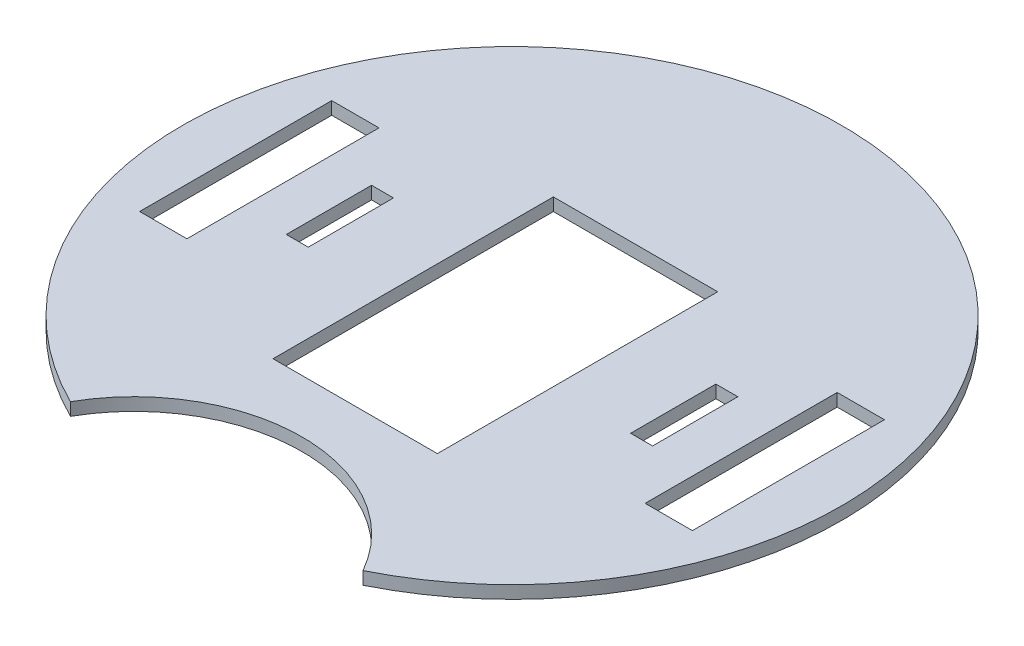
ISO-10303-21;
HEADER;
FILE_DESCRIPTION(('STEP AP214'),'2;1');
FILE_NAME('part.step','',(''),(''),'','','');
FILE_SCHEMA(('AUTOMOTIVE_DESIGN { 1 0 10303 214 1 1 1 1 }'));
ENDSEC;
DATA;
#1=APPLICATION_CONTEXT('core data for automotive mechanical design processes');
#2=APPLICATION_PROTOCOL_DEFINITION('international standard','automotive_design',2000,#1);
#3=PRODUCT_CONTEXT('',#1,'mechanical');
#4=PRODUCT('Part','Part','',(#3));
#5=PRODUCT_RELATED_PRODUCT_CATEGORY('part','',(#4));
#6=PRODUCT_DEFINITION_FORMATION('','',#4);
#7=PRODUCT_DEFINITION_CONTEXT('part definition',#1,'design');
#8=PRODUCT_DEFINITION('design','',#6,#7);
#9=PRODUCT_DEFINITION_SHAPE('','',#8);
#10=(LENGTH_UNIT() NAMED_UNIT(*) SI_UNIT(.MILLI.,.METRE.));
#11=(NAMED_UNIT(*) PLANE_ANGLE_UNIT() SI_UNIT($,.RADIAN.));
#12=(NAMED_UNIT(*) SI_UNIT($,.STERADIAN.) SOLID_ANGLE_UNIT());
#13=UNCERTAINTY_MEASURE_WITH_UNIT(LENGTH_MEASURE(1.E-05),#10,'distance_accuracy_value','');
#14=(GEOMETRIC_REPRESENTATION_CONTEXT(3) GLOBAL_UNCERTAINTY_ASSIGNED_CONTEXT((#13)) GLOBAL_UNIT_ASSIGNED_CONTEXT((#10,
#11,#12)) REPRESENTATION_CONTEXT('',''));
#15=CARTESIAN_POINT('',(0.,0.,0.));
#16=DIRECTION('',(0.,0.,1.));
#17=DIRECTION('',(1.,0.,0.));
#18=AXIS2_PLACEMENT_3D('',#15,#16,#17);
#19=CARTESIAN_POINT('',(0.,2.9,86.0416168146049));
#20=DIRECTION('',(0.,-1.,0.));
#21=DIRECTION('',(0.,0.,-1.));
#22=AXIS2_PLACEMENT_3D('',#19,#20,#21);
#23=CYLINDRICAL_SURFACE('',#22,38.25);
#24=CARTESIAN_POINT('',(0.,0.,86.0416168146049));
#25=DIRECTION('',(0.,-1.,0.));
#26=DIRECTION('',(0.,0.,1.));
#27=AXIS2_PLACEMENT_3D('',#24,#25,#26);
#28=CIRCLE('',#27,38.25);
#29=CARTESIAN_POINT('',(-33.2911053697012,0.,67.2064156406474));
#30=VERTEX_POINT('',#29);
#31=CARTESIAN_POINT('',(33.2911053697012,0.,67.2064156406474));
#32=VERTEX_POINT('',#31);
#33=EDGE_CURVE('E339',#30,#32,#28,.T.);
#34=ORIENTED_EDGE('',*,*,#33,.T.);
#35=DIRECTION('',(0.,-1.,0.));
#36=VECTOR('',#35,1.);
#37=CARTESIAN_POINT('',(33.2911053697012,2.9,67.2064156406474));
#38=LINE('',#37,#36);
#39=CARTESIAN_POINT('',(33.2911053697012,2.9,67.2064156406474));
#40=VERTEX_POINT('',#39);
#41=EDGE_CURVE('E11',#40,#32,#38,.T.);
#42=ORIENTED_EDGE('',*,*,#41,.F.);
#43=CARTESIAN_POINT('',(0.,2.9,86.0416168146049));
#44=DIRECTION('',(0.,-1.,0.));
#45=DIRECTION('',(0.,0.,1.));
#46=AXIS2_PLACEMENT_3D('',#43,#44,#45);
#47=CIRCLE('',#46,38.25);
#48=CARTESIAN_POINT('',(-33.2911053697012,2.9,67.2064156406474));
#49=VERTEX_POINT('',#48);
#50=EDGE_CURVE('E346',#49,#40,#47,.T.);
#51=ORIENTED_EDGE('',*,*,#50,.F.);
#52=DIRECTION('',(0.,-1.,0.));
#53=VECTOR('',#52,1.);
#54=CARTESIAN_POINT('',(-33.2911053697012,2.9,67.2064156406474));
#55=LINE('',#54,#53);
#56=EDGE_CURVE('E40',#49,#30,#55,.T.);
#57=ORIENTED_EDGE('',*,*,#56,.T.);
#58=EDGE_LOOP('',(#34,#42,#51,#57));
#59=FACE_BOUND('',#58,.T.);
#60=ADVANCED_FACE('F33',(#59),#23,.F.);
#61=CARTESIAN_POINT('',(0.,2.9,0.));
#62=DIRECTION('',(0.,-1.,0.));
#63=DIRECTION('',(0.,0.,-1.));
#64=AXIS2_PLACEMENT_3D('',#61,#62,#63);
#65=CYLINDRICAL_SURFACE('',#64,75.);
#66=CARTESIAN_POINT('',(0.,0.,0.));
#67=DIRECTION('',(0.,1.,0.));
#68=DIRECTION('',(0.,0.,1.));
#69=AXIS2_PLACEMENT_3D('',#66,#67,#68);
#70=CIRCLE('',#69,75.);
#71=EDGE_CURVE('E350',#32,#30,#70,.T.);
#72=ORIENTED_EDGE('',*,*,#71,.T.);
#73=ORIENTED_EDGE('',*,*,#56,.F.);
#74=CARTESIAN_POINT('',(0.,2.9,0.));
#75=DIRECTION('',(0.,1.,0.));
#76=DIRECTION('',(0.,0.,1.));
#77=AXIS2_PLACEMENT_3D('',#74,#75,#76);
#78=CIRCLE('',#77,75.);
#79=EDGE_CURVE('E349',#40,#49,#78,.T.);
#80=ORIENTED_EDGE('',*,*,#79,.F.);
#81=ORIENTED_EDGE('',*,*,#41,.T.);
#82=EDGE_LOOP('',(#72,#73,#80,#81));
#83=FACE_BOUND('',#82,.T.);
#84=ADVANCED_FACE('F362',(#83),#65,.T.);
#85=CARTESIAN_POINT('',(0.,2.9,43.0208084073025));
#86=DIRECTION('',(0.,1.,0.));
#87=DIRECTION('',(0.,0.,1.));
#88=AXIS2_PLACEMENT_3D('',#85,#86,#87);
#89=PLANE('',#88);
#90=DIRECTION('',(-1.,0.,0.));
#91=VECTOR('',#90,1.);
#92=CARTESIAN_POINT('',(41.6798528025296,2.9,-9.7));
#93=LINE('',#92,#91);
#94=CARTESIAN_POINT('',(41.6798528025296,2.9,-9.7));
#95=VERTEX_POINT('',#94);
#96=CARTESIAN_POINT('',(36.6798528025296,2.9,-9.69999999999999));
#97=VERTEX_POINT('',#96);
#98=EDGE_CURVE('E47',#95,#97,#93,.T.);
#99=ORIENTED_EDGE('',*,*,#98,.F.);
#100=DIRECTION('',(0.,0.,-1.));
#101=VECTOR('',#100,1.);
#102=CARTESIAN_POINT('',(41.6798528025296,2.9,9.7));
#103=LINE('',#102,#101);
#104=CARTESIAN_POINT('',(41.6798528025296,2.9,9.7));
#105=VERTEX_POINT('',#104);
#106=EDGE_CURVE('E199',#105,#95,#103,.T.);
#107=ORIENTED_EDGE('',*,*,#106,.F.);
#108=DIRECTION('',(1.,0.,0.));
#109=VECTOR('',#108,1.);
#110=CARTESIAN_POINT('',(41.6798528025296,2.9,9.7));
#111=LINE('',#110,#109);
#112=CARTESIAN_POINT('',(36.6798528025296,2.9,9.7));
#113=VERTEX_POINT('',#112);
#114=EDGE_CURVE('E202',#113,#105,#111,.T.);
#115=ORIENTED_EDGE('',*,*,#114,.F.);
#116=DIRECTION('',(0.,0.,1.));
#117=VECTOR('',#116,1.);
#118=CARTESIAN_POINT('',(36.6798528025296,2.9,9.7));
#119=LINE('',#118,#117);
#120=EDGE_CURVE('E208',#97,#113,#119,.T.);
#121=ORIENTED_EDGE('',*,*,#120,.F.);
#122=EDGE_LOOP('',(#99,#107,#115,#121));
#123=FACE_BOUND('',#122,.T.);
#124=DIRECTION('',(0.,0.,1.));
#125=VECTOR('',#124,1.);
#126=CARTESIAN_POINT('',(-41.6798528025296,2.9,9.7));
#127=LINE('',#126,#125);
#128=CARTESIAN_POINT('',(-41.6798528025296,2.9,-9.7));
#129=VERTEX_POINT('',#128);
#130=CARTESIAN_POINT('',(-41.6798528025296,2.9,9.7));
#131=VERTEX_POINT('',#130);
#132=EDGE_CURVE('E214',#129,#131,#127,.T.);
#133=ORIENTED_EDGE('',*,*,#132,.F.);
#134=DIRECTION('',(-1.,0.,0.));
#135=VECTOR('',#134,1.);
#136=CARTESIAN_POINT('',(-41.6798528025296,2.9,-9.7));
#137=LINE('',#136,#135);
#138=CARTESIAN_POINT('',(-36.6798528025296,2.9,-9.7));
#139=VERTEX_POINT('',#138);
#140=EDGE_CURVE('E222',#139,#129,#137,.T.);
#141=ORIENTED_EDGE('',*,*,#140,.F.);
#142=DIRECTION('',(0.,0.,-1.));
#143=VECTOR('',#142,1.);
#144=CARTESIAN_POINT('',(-36.6798528025296,2.9,9.7));
#145=LINE('',#144,#143);
#146=CARTESIAN_POINT('',(-36.6798528025296,2.9,9.7));
#147=VERTEX_POINT('',#146);
#148=EDGE_CURVE('E236',#147,#139,#145,.T.);
#149=ORIENTED_EDGE('',*,*,#148,.F.);
#150=DIRECTION('',(1.,0.,0.));
#151=VECTOR('',#150,1.);
#152=CARTESIAN_POINT('',(-41.6798528025296,2.9,9.7));
#153=LINE('',#152,#151);
#154=EDGE_CURVE('E233',#131,#147,#153,.T.);
#155=ORIENTED_EDGE('',*,*,#154,.F.);
#156=EDGE_LOOP('',(#133,#141,#149,#155));
#157=FACE_BOUND('',#156,.T.);
#158=DIRECTION('',(0.,0.,1.));
#159=VECTOR('',#158,1.);
#160=CARTESIAN_POINT('',(52.1374919880577,2.9,21.8538025937416));
#161=LINE('',#160,#159);
#162=CARTESIAN_POINT('',(52.1374919880577,2.9,-21.8538025937417));
#163=VERTEX_POINT('',#162);
#164=CARTESIAN_POINT('',(52.1374919880577,2.9,21.8538025937416));
#165=VERTEX_POINT('',#164);
#166=EDGE_CURVE('E243',#163,#165,#161,.T.);
#167=ORIENTED_EDGE('',*,*,#166,.F.);
#168=DIRECTION('',(-1.,0.,0.));
#169=VECTOR('',#168,1.);
#170=CARTESIAN_POINT('',(62.8974919880577,2.9,-21.8538025937417));
#171=LINE('',#170,#169);
#172=CARTESIAN_POINT('',(62.8974919880577,2.9,-21.8538025937417));
#173=VERTEX_POINT('',#172);
#174=EDGE_CURVE('E254',#173,#163,#171,.T.);
#175=ORIENTED_EDGE('',*,*,#174,.F.);
#176=DIRECTION('',(0.,0.,-1.));
#177=VECTOR('',#176,1.);
#178=CARTESIAN_POINT('',(62.8974919880577,2.9,21.8538025937416));
#179=LINE('',#178,#177);
#180=CARTESIAN_POINT('',(62.8974919880577,2.9,21.8538025937416));
#181=VERTEX_POINT('',#180);
#182=EDGE_CURVE('E268',#181,#173,#179,.T.);
#183=ORIENTED_EDGE('',*,*,#182,.F.);
#184=DIRECTION('',(1.,0.,0.));
#185=VECTOR('',#184,1.);
#186=CARTESIAN_POINT('',(62.8974919880577,2.9,21.8538025937416));
#187=LINE('',#186,#185);
#188=EDGE_CURVE('E265',#165,#181,#187,.T.);
#189=ORIENTED_EDGE('',*,*,#188,.F.);
#190=EDGE_LOOP('',(#167,#175,#183,#189));
#191=FACE_BOUND('',#190,.T.);
#192=DIRECTION('',(0.,0.,1.));
#193=VECTOR('',#192,1.);
#194=CARTESIAN_POINT('',(-62.8974919880577,2.9,21.8538025937416));
#195=LINE('',#194,#193);
#196=CARTESIAN_POINT('',(-62.8974919880577,2.9,-21.8538025937417));
#197=VERTEX_POINT('',#196);
#198=CARTESIAN_POINT('',(-62.8974919880577,2.9,21.8538025937416));
#199=VERTEX_POINT('',#198);
#200=EDGE_CURVE('E275',#197,#199,#195,.T.);
#201=ORIENTED_EDGE('',*,*,#200,.F.);
#202=DIRECTION('',(-1.,0.,0.));
#203=VECTOR('',#202,1.);
#204=CARTESIAN_POINT('',(-62.8974919880577,2.9,-21.8538025937417));
#205=LINE('',#204,#203);
#206=CARTESIAN_POINT('',(-52.1374919880577,2.9,-21.8538025937417));
#207=VERTEX_POINT('',#206);
#208=EDGE_CURVE('E286',#207,#197,#205,.T.);
#209=ORIENTED_EDGE('',*,*,#208,.F.);
#210=DIRECTION('',(0.,0.,-1.));
#211=VECTOR('',#210,1.);
#212=CARTESIAN_POINT('',(-52.1374919880577,2.9,21.8538025937416));
#213=LINE('',#212,#211);
#214=CARTESIAN_POINT('',(-52.1374919880577,2.9,21.8538025937416));
#215=VERTEX_POINT('',#214);
#216=EDGE_CURVE('E300',#215,#207,#213,.T.);
#217=ORIENTED_EDGE('',*,*,#216,.F.);
#218=DIRECTION('',(1.,0.,0.));
#219=VECTOR('',#218,1.);
#220=CARTESIAN_POINT('',(-62.8974919880577,2.9,21.8538025937416));
#221=LINE('',#220,#219);
#222=EDGE_CURVE('E297',#199,#215,#221,.T.);
#223=ORIENTED_EDGE('',*,*,#222,.F.);
#224=EDGE_LOOP('',(#201,#209,#217,#223));
#225=FACE_BOUND('',#224,.T.);
#226=DIRECTION('',(0.,0.,1.));
#227=VECTOR('',#226,1.);
#228=CARTESIAN_POINT('',(-18.7,2.9,35.7));
#229=LINE('',#228,#227);
#230=CARTESIAN_POINT('',(-18.7,2.9,-28.1));
#231=VERTEX_POINT('',#230);
#232=CARTESIAN_POINT('',(-18.7,2.9,35.7));
#233=VERTEX_POINT('',#232);
#234=EDGE_CURVE('E307',#231,#233,#229,.T.);
#235=ORIENTED_EDGE('',*,*,#234,.F.);
#236=DIRECTION('',(-1.,0.,0.));
#237=VECTOR('',#236,1.);
#238=CARTESIAN_POINT('',(-18.7,2.9,-28.1));
#239=LINE('',#238,#237);
#240=CARTESIAN_POINT('',(18.7,2.9,-28.1));
#241=VERTEX_POINT('',#240);
#242=EDGE_CURVE('E318',#241,#231,#239,.T.);
#243=ORIENTED_EDGE('',*,*,#242,.F.);
#244=DIRECTION('',(0.,0.,-1.));
#245=VECTOR('',#244,1.);
#246=CARTESIAN_POINT('',(18.7,2.9,35.7));
#247=LINE('',#246,#245);
#248=CARTESIAN_POINT('',(18.7,2.9,35.7));
#249=VERTEX_POINT('',#248);
#250=EDGE_CURVE('E332',#249,#241,#247,.T.);
#251=ORIENTED_EDGE('',*,*,#250,.F.);
#252=DIRECTION('',(1.,0.,0.));
#253=VECTOR('',#252,1.);
#254=CARTESIAN_POINT('',(-18.7,2.9,35.7));
#255=LINE('',#254,#253);
#256=EDGE_CURVE('E329',#233,#249,#255,.T.);
#257=ORIENTED_EDGE('',*,*,#256,.F.);
#258=EDGE_LOOP('',(#235,#243,#251,#257));
#259=FACE_BOUND('',#258,.T.);
#260=ORIENTED_EDGE('',*,*,#50,.T.);
#261=ORIENTED_EDGE('',*,*,#79,.T.);
#262=EDGE_LOOP('',(#260,#261));
#263=FACE_BOUND('',#262,.T.);
#264=ADVANCED_FACE('F364',(#123,#157,#191,#225,#259,#263),#89,.T.);
#265=CARTESIAN_POINT('',(0.,0.,43.0208084073025));
#266=DIRECTION('',(0.,1.,0.));
#267=DIRECTION('',(0.,0.,1.));
#268=AXIS2_PLACEMENT_3D('',#265,#266,#267);
#269=PLANE('',#268);
#270=DIRECTION('',(0.,0.,-1.));
#271=VECTOR('',#270,1.);
#272=CARTESIAN_POINT('',(41.6798528025296,0.,9.7));
#273=LINE('',#272,#271);
#274=CARTESIAN_POINT('',(41.6798528025296,0.,9.7));
#275=VERTEX_POINT('',#274);
#276=CARTESIAN_POINT('',(41.6798528025296,0.,-9.7));
#277=VERTEX_POINT('',#276);
#278=EDGE_CURVE('E189',#275,#277,#273,.T.);
#279=ORIENTED_EDGE('',*,*,#278,.T.);
#280=DIRECTION('',(-1.,0.,0.));
#281=VECTOR('',#280,1.);
#282=CARTESIAN_POINT('',(41.6798528025296,0.,-9.7));
#283=LINE('',#282,#281);
#284=CARTESIAN_POINT('',(36.6798528025296,0.,-9.7));
#285=VERTEX_POINT('',#284);
#286=EDGE_CURVE('E183',#277,#285,#283,.T.);
#287=ORIENTED_EDGE('',*,*,#286,.T.);
#288=DIRECTION('',(0.,0.,1.));
#289=VECTOR('',#288,1.);
#290=CARTESIAN_POINT('',(36.6798528025296,0.,9.7));
#291=LINE('',#290,#289);
#292=CARTESIAN_POINT('',(36.6798528025296,0.,9.7));
#293=VERTEX_POINT('',#292);
#294=EDGE_CURVE('E192',#285,#293,#291,.T.);
#295=ORIENTED_EDGE('',*,*,#294,.T.);
#296=DIRECTION('',(1.,0.,0.));
#297=VECTOR('',#296,1.);
#298=CARTESIAN_POINT('',(41.6798528025296,0.,9.7));
#299=LINE('',#298,#297);
#300=EDGE_CURVE('E55',#293,#275,#299,.T.);
#301=ORIENTED_EDGE('',*,*,#300,.T.);
#302=EDGE_LOOP('',(#279,#287,#295,#301));
#303=FACE_BOUND('',#302,.T.);
#304=DIRECTION('',(-1.,0.,0.));
#305=VECTOR('',#304,1.);
#306=CARTESIAN_POINT('',(-41.6798528025296,0.,-9.7));
#307=LINE('',#306,#305);
#308=CARTESIAN_POINT('',(-36.6798528025296,0.,-9.7));
#309=VERTEX_POINT('',#308);
#310=CARTESIAN_POINT('',(-41.6798528025296,0.,-9.7));
#311=VERTEX_POINT('',#310);
#312=EDGE_CURVE('E228',#309,#311,#307,.T.);
#313=ORIENTED_EDGE('',*,*,#312,.T.);
#314=DIRECTION('',(0.,0.,1.));
#315=VECTOR('',#314,1.);
#316=CARTESIAN_POINT('',(-41.6798528025296,0.,9.7));
#317=LINE('',#316,#315);
#318=CARTESIAN_POINT('',(-41.6798528025296,0.,9.7));
#319=VERTEX_POINT('',#318);
#320=EDGE_CURVE('E218',#311,#319,#317,.T.);
#321=ORIENTED_EDGE('',*,*,#320,.T.);
#322=DIRECTION('',(1.,0.,0.));
#323=VECTOR('',#322,1.);
#324=CARTESIAN_POINT('',(-41.6798528025296,0.,9.7));
#325=LINE('',#324,#323);
#326=CARTESIAN_POINT('',(-36.6798528025296,0.,9.7));
#327=VERTEX_POINT('',#326);
#328=EDGE_CURVE('E221',#319,#327,#325,.T.);
#329=ORIENTED_EDGE('',*,*,#328,.T.);
#330=DIRECTION('',(0.,0.,-1.));
#331=VECTOR('',#330,1.);
#332=CARTESIAN_POINT('',(-36.6798528025296,0.,9.7));
#333=LINE('',#332,#331);
#334=EDGE_CURVE('E225',#327,#309,#333,.T.);
#335=ORIENTED_EDGE('',*,*,#334,.T.);
#336=EDGE_LOOP('',(#313,#321,#329,#335));
#337=FACE_BOUND('',#336,.T.);
#338=DIRECTION('',(-1.,0.,0.));
#339=VECTOR('',#338,1.);
#340=CARTESIAN_POINT('',(62.8974919880577,0.,-21.8538025937417));
#341=LINE('',#340,#339);
#342=CARTESIAN_POINT('',(62.8974919880577,0.,-21.8538025937417));
#343=VERTEX_POINT('',#342);
#344=CARTESIAN_POINT('',(52.1374919880577,0.,-21.8538025937417));
#345=VERTEX_POINT('',#344);
#346=EDGE_CURVE('E260',#343,#345,#341,.T.);
#347=ORIENTED_EDGE('',*,*,#346,.T.);
#348=DIRECTION('',(0.,0.,1.));
#349=VECTOR('',#348,1.);
#350=CARTESIAN_POINT('',(52.1374919880577,0.,21.8538025937416));
#351=LINE('',#350,#349);
#352=CARTESIAN_POINT('',(52.1374919880577,0.,21.8538025937416));
#353=VERTEX_POINT('',#352);
#354=EDGE_CURVE('E250',#345,#353,#351,.T.);
#355=ORIENTED_EDGE('',*,*,#354,.T.);
#356=DIRECTION('',(1.,0.,0.));
#357=VECTOR('',#356,1.);
#358=CARTESIAN_POINT('',(62.8974919880577,0.,21.8538025937416));
#359=LINE('',#358,#357);
#360=CARTESIAN_POINT('',(62.8974919880577,0.,21.8538025937416));
#361=VERTEX_POINT('',#360);
#362=EDGE_CURVE('E253',#353,#361,#359,.T.);
#363=ORIENTED_EDGE('',*,*,#362,.T.);
#364=DIRECTION('',(0.,0.,-1.));
#365=VECTOR('',#364,1.);
#366=CARTESIAN_POINT('',(62.8974919880577,0.,21.8538025937416));
#367=LINE('',#366,#365);
#368=EDGE_CURVE('E257',#361,#343,#367,.T.);
#369=ORIENTED_EDGE('',*,*,#368,.T.);
#370=EDGE_LOOP('',(#347,#355,#363,#369));
#371=FACE_BOUND('',#370,.T.);
#372=DIRECTION('',(-1.,0.,0.));
#373=VECTOR('',#372,1.);
#374=CARTESIAN_POINT('',(-62.8974919880577,0.,-21.8538025937417));
#375=LINE('',#374,#373);
#376=CARTESIAN_POINT('',(-52.1374919880577,0.,-21.8538025937417));
#377=VERTEX_POINT('',#376);
#378=CARTESIAN_POINT('',(-62.8974919880577,0.,-21.8538025937417));
#379=VERTEX_POINT('',#378);
#380=EDGE_CURVE('E292',#377,#379,#375,.T.);
#381=ORIENTED_EDGE('',*,*,#380,.T.);
#382=DIRECTION('',(0.,0.,1.));
#383=VECTOR('',#382,1.);
#384=CARTESIAN_POINT('',(-62.8974919880577,0.,21.8538025937416));
#385=LINE('',#384,#383);
#386=CARTESIAN_POINT('',(-62.8974919880577,0.,21.8538025937416));
#387=VERTEX_POINT('',#386);
#388=EDGE_CURVE('E282',#379,#387,#385,.T.);
#389=ORIENTED_EDGE('',*,*,#388,.T.);
#390=DIRECTION('',(1.,0.,0.));
#391=VECTOR('',#390,1.);
#392=CARTESIAN_POINT('',(-62.8974919880577,0.,21.8538025937416));
#393=LINE('',#392,#391);
#394=CARTESIAN_POINT('',(-52.1374919880577,0.,21.8538025937416));
#395=VERTEX_POINT('',#394);
#396=EDGE_CURVE('E285',#387,#395,#393,.T.);
#397=ORIENTED_EDGE('',*,*,#396,.T.);
#398=DIRECTION('',(0.,0.,-1.));
#399=VECTOR('',#398,1.);
#400=CARTESIAN_POINT('',(-52.1374919880577,0.,21.8538025937416));
#401=LINE('',#400,#399);
#402=EDGE_CURVE('E289',#395,#377,#401,.T.);
#403=ORIENTED_EDGE('',*,*,#402,.T.);
#404=EDGE_LOOP('',(#381,#389,#397,#403));
#405=FACE_BOUND('',#404,.T.);
#406=DIRECTION('',(-1.,0.,0.));
#407=VECTOR('',#406,1.);
#408=CARTESIAN_POINT('',(-18.7,0.,-28.1));
#409=LINE('',#408,#407);
#410=CARTESIAN_POINT('',(18.7,0.,-28.1));
#411=VERTEX_POINT('',#410);
#412=CARTESIAN_POINT('',(-18.7,0.,-28.1));
#413=VERTEX_POINT('',#412);
#414=EDGE_CURVE('E324',#411,#413,#409,.T.);
#415=ORIENTED_EDGE('',*,*,#414,.T.);
#416=DIRECTION('',(0.,0.,1.));
#417=VECTOR('',#416,1.);
#418=CARTESIAN_POINT('',(-18.7,0.,35.7));
#419=LINE('',#418,#417);
#420=CARTESIAN_POINT('',(-18.7,0.,35.7));
#421=VERTEX_POINT('',#420);
#422=EDGE_CURVE('E314',#413,#421,#419,.T.);
#423=ORIENTED_EDGE('',*,*,#422,.T.);
#424=DIRECTION('',(1.,0.,0.));
#425=VECTOR('',#424,1.);
#426=CARTESIAN_POINT('',(-18.7,0.,35.7));
#427=LINE('',#426,#425);
#428=CARTESIAN_POINT('',(18.7,0.,35.7));
#429=VERTEX_POINT('',#428);
#430=EDGE_CURVE('E317',#421,#429,#427,.T.);
#431=ORIENTED_EDGE('',*,*,#430,.T.);
#432=DIRECTION('',(0.,0.,-1.));
#433=VECTOR('',#432,1.);
#434=CARTESIAN_POINT('',(18.7,0.,35.7));
#435=LINE('',#434,#433);
#436=EDGE_CURVE('E321',#429,#411,#435,.T.);
#437=ORIENTED_EDGE('',*,*,#436,.T.);
#438=EDGE_LOOP('',(#415,#423,#431,#437));
#439=FACE_BOUND('',#438,.T.);
#440=ORIENTED_EDGE('',*,*,#33,.F.);
#441=ORIENTED_EDGE('',*,*,#71,.F.);
#442=EDGE_LOOP('',(#440,#441));
#443=FACE_BOUND('',#442,.T.);
#444=ADVANCED_FACE('F196',(#303,#337,#371,#405,#439,#443),#269,.F.);
#445=CARTESIAN_POINT('',(-18.7,0.,35.7));
#446=DIRECTION('',(-1.,0.,0.));
#447=DIRECTION('',(0.,0.,1.));
#448=AXIS2_PLACEMENT_3D('',#445,#446,#447);
#449=PLANE('',#448);
#450=ORIENTED_EDGE('',*,*,#234,.T.);
#451=DIRECTION('',(0.,1.,0.));
#452=VECTOR('',#451,1.);
#453=CARTESIAN_POINT('',(-18.7,0.,35.7));
#454=LINE('',#453,#452);
#455=EDGE_CURVE('E327',#421,#233,#454,.T.);
#456=ORIENTED_EDGE('',*,*,#455,.F.);
#457=ORIENTED_EDGE('',*,*,#422,.F.);
#458=DIRECTION('',(0.,1.,0.));
#459=VECTOR('',#458,1.);
#460=CARTESIAN_POINT('',(-18.7,0.,-28.1));
#461=LINE('',#460,#459);
#462=EDGE_CURVE('E337',#413,#231,#461,.T.);
#463=ORIENTED_EDGE('',*,*,#462,.T.);
#464=EDGE_LOOP('',(#450,#456,#457,#463));
#465=FACE_BOUND('',#464,.T.);
#466=ADVANCED_FACE('F372',(#465),#449,.F.);
#467=CARTESIAN_POINT('',(-18.7,0.,-28.1));
#468=DIRECTION('',(0.,0.,-1.));
#469=DIRECTION('',(-1.,0.,0.));
#470=AXIS2_PLACEMENT_3D('',#467,#468,#469);
#471=PLANE('',#470);
#472=ORIENTED_EDGE('',*,*,#242,.T.);
#473=ORIENTED_EDGE('',*,*,#462,.F.);
#474=ORIENTED_EDGE('',*,*,#414,.F.);
#475=DIRECTION('',(0.,1.,0.));
#476=VECTOR('',#475,1.);
#477=CARTESIAN_POINT('',(18.7,0.,-28.1));
#478=LINE('',#477,#476);
#479=EDGE_CURVE('E340',#411,#241,#478,.T.);
#480=ORIENTED_EDGE('',*,*,#479,.T.);
#481=EDGE_LOOP('',(#472,#473,#474,#480));
#482=FACE_BOUND('',#481,.T.);
#483=ADVANCED_FACE('F393',(#482),#471,.F.);
#484=CARTESIAN_POINT('',(18.7,0.,35.7));
#485=DIRECTION('',(1.,0.,0.));
#486=DIRECTION('',(0.,0.,-1.));
#487=AXIS2_PLACEMENT_3D('',#484,#485,#486);
#488=PLANE('',#487);
#489=ORIENTED_EDGE('',*,*,#250,.T.);
#490=ORIENTED_EDGE('',*,*,#479,.F.);
#491=ORIENTED_EDGE('',*,*,#436,.F.);
#492=DIRECTION('',(0.,1.,0.));
#493=VECTOR('',#492,1.);
#494=CARTESIAN_POINT('',(18.7,0.,35.7));
#495=LINE('',#494,#493);
#496=EDGE_CURVE('E342',#429,#249,#495,.T.);
#497=ORIENTED_EDGE('',*,*,#496,.T.);
#498=EDGE_LOOP('',(#489,#490,#491,#497));
#499=FACE_BOUND('',#498,.T.);
#500=ADVANCED_FACE('F403',(#499),#488,.F.);
#501=CARTESIAN_POINT('',(-18.7,0.,35.7));
#502=DIRECTION('',(0.,0.,1.));
#503=DIRECTION('',(1.,0.,0.));
#504=AXIS2_PLACEMENT_3D('',#501,#502,#503);
#505=PLANE('',#504);
#506=ORIENTED_EDGE('',*,*,#256,.T.);
#507=ORIENTED_EDGE('',*,*,#496,.F.);
#508=ORIENTED_EDGE('',*,*,#430,.F.);
#509=ORIENTED_EDGE('',*,*,#455,.T.);
#510=EDGE_LOOP('',(#506,#507,#508,#509));
#511=FACE_BOUND('',#510,.T.);
#512=ADVANCED_FACE('F413',(#511),#505,.F.);
#513=CARTESIAN_POINT('',(-62.8974919880577,0.,21.8538025937416));
#514=DIRECTION('',(-1.,0.,0.));
#515=DIRECTION('',(0.,0.,1.));
#516=AXIS2_PLACEMENT_3D('',#513,#514,#515);
#517=PLANE('',#516);
#518=ORIENTED_EDGE('',*,*,#200,.T.);
#519=DIRECTION('',(0.,1.,0.));
#520=VECTOR('',#519,1.);
#521=CARTESIAN_POINT('',(-62.8974919880577,0.,21.8538025937416));
#522=LINE('',#521,#520);
#523=EDGE_CURVE('E295',#387,#199,#522,.T.);
#524=ORIENTED_EDGE('',*,*,#523,.F.);
#525=ORIENTED_EDGE('',*,*,#388,.F.);
#526=DIRECTION('',(0.,1.,0.));
#527=VECTOR('',#526,1.);
#528=CARTESIAN_POINT('',(-62.8974919880577,0.,-21.8538025937417));
#529=LINE('',#528,#527);
#530=EDGE_CURVE('E305',#379,#197,#529,.T.);
#531=ORIENTED_EDGE('',*,*,#530,.T.);
#532=EDGE_LOOP('',(#518,#524,#525,#531));
#533=FACE_BOUND('',#532,.T.);
#534=ADVANCED_FACE('F423',(#533),#517,.F.);
#535=CARTESIAN_POINT('',(-62.8974919880577,0.,-21.8538025937417));
#536=DIRECTION('',(0.,0.,-1.));
#537=DIRECTION('',(-1.,0.,0.));
#538=AXIS2_PLACEMENT_3D('',#535,#536,#537);
#539=PLANE('',#538);
#540=ORIENTED_EDGE('',*,*,#208,.T.);
#541=ORIENTED_EDGE('',*,*,#530,.F.);
#542=ORIENTED_EDGE('',*,*,#380,.F.);
#543=DIRECTION('',(0.,1.,0.));
#544=VECTOR('',#543,1.);
#545=CARTESIAN_POINT('',(-52.1374919880577,0.,-21.8538025937417));
#546=LINE('',#545,#544);
#547=EDGE_CURVE('E308',#377,#207,#546,.T.);
#548=ORIENTED_EDGE('',*,*,#547,.T.);
#549=EDGE_LOOP('',(#540,#541,#542,#548));
#550=FACE_BOUND('',#549,.T.);
#551=ADVANCED_FACE('F433',(#550),#539,.F.);
#552=CARTESIAN_POINT('',(-52.1374919880577,0.,21.8538025937416));
#553=DIRECTION('',(1.,0.,0.));
#554=DIRECTION('',(0.,0.,-1.));
#555=AXIS2_PLACEMENT_3D('',#552,#553,#554);
#556=PLANE('',#555);
#557=ORIENTED_EDGE('',*,*,#216,.T.);
#558=ORIENTED_EDGE('',*,*,#547,.F.);
#559=ORIENTED_EDGE('',*,*,#402,.F.);
#560=DIRECTION('',(0.,1.,0.));
#561=VECTOR('',#560,1.);
#562=CARTESIAN_POINT('',(-52.1374919880577,0.,21.8538025937416));
#563=LINE('',#562,#561);
#564=EDGE_CURVE('E310',#395,#215,#563,.T.);
#565=ORIENTED_EDGE('',*,*,#564,.T.);
#566=EDGE_LOOP('',(#557,#558,#559,#565));
#567=FACE_BOUND('',#566,.T.);
#568=ADVANCED_FACE('F443',(#567),#556,.F.);
#569=CARTESIAN_POINT('',(-62.8974919880577,0.,21.8538025937416));
#570=DIRECTION('',(0.,0.,1.));
#571=DIRECTION('',(1.,0.,0.));
#572=AXIS2_PLACEMENT_3D('',#569,#570,#571);
#573=PLANE('',#572);
#574=ORIENTED_EDGE('',*,*,#222,.T.);
#575=ORIENTED_EDGE('',*,*,#564,.F.);
#576=ORIENTED_EDGE('',*,*,#396,.F.);
#577=ORIENTED_EDGE('',*,*,#523,.T.);
#578=EDGE_LOOP('',(#574,#575,#576,#577));
#579=FACE_BOUND('',#578,.T.);
#580=ADVANCED_FACE('F453',(#579),#573,.F.);
#581=CARTESIAN_POINT('',(52.1374919880577,0.,21.8538025937416));
#582=DIRECTION('',(-1.,0.,0.));
#583=DIRECTION('',(0.,0.,1.));
#584=AXIS2_PLACEMENT_3D('',#581,#582,#583);
#585=PLANE('',#584);
#586=ORIENTED_EDGE('',*,*,#166,.T.);
#587=DIRECTION('',(0.,1.,0.));
#588=VECTOR('',#587,1.);
#589=CARTESIAN_POINT('',(52.1374919880577,0.,21.8538025937416));
#590=LINE('',#589,#588);
#591=EDGE_CURVE('E263',#353,#165,#590,.T.);
#592=ORIENTED_EDGE('',*,*,#591,.F.);
#593=ORIENTED_EDGE('',*,*,#354,.F.);
#594=DIRECTION('',(0.,1.,0.));
#595=VECTOR('',#594,1.);
#596=CARTESIAN_POINT('',(52.1374919880577,0.,-21.8538025937417));
#597=LINE('',#596,#595);
#598=EDGE_CURVE('E273',#345,#163,#597,.T.);
#599=ORIENTED_EDGE('',*,*,#598,.T.);
#600=EDGE_LOOP('',(#586,#592,#593,#599));
#601=FACE_BOUND('',#600,.T.);
#602=ADVANCED_FACE('F463',(#601),#585,.F.);
#603=CARTESIAN_POINT('',(62.8974919880577,0.,-21.8538025937417));
#604=DIRECTION('',(0.,0.,-1.));
#605=DIRECTION('',(-1.,0.,0.));
#606=AXIS2_PLACEMENT_3D('',#603,#604,#605);
#607=PLANE('',#606);
#608=ORIENTED_EDGE('',*,*,#174,.T.);
#609=ORIENTED_EDGE('',*,*,#598,.F.);
#610=ORIENTED_EDGE('',*,*,#346,.F.);
#611=DIRECTION('',(0.,1.,0.));
#612=VECTOR('',#611,1.);
#613=CARTESIAN_POINT('',(62.8974919880577,0.,-21.8538025937417));
#614=LINE('',#613,#612);
#615=EDGE_CURVE('E276',#343,#173,#614,.T.);
#616=ORIENTED_EDGE('',*,*,#615,.T.);
#617=EDGE_LOOP('',(#608,#609,#610,#616));
#618=FACE_BOUND('',#617,.T.);
#619=ADVANCED_FACE('F473',(#618),#607,.F.);
#620=CARTESIAN_POINT('',(62.8974919880577,0.,21.8538025937416));
#621=DIRECTION('',(1.,0.,0.));
#622=DIRECTION('',(0.,0.,-1.));
#623=AXIS2_PLACEMENT_3D('',#620,#621,#622);
#624=PLANE('',#623);
#625=ORIENTED_EDGE('',*,*,#182,.T.);
#626=ORIENTED_EDGE('',*,*,#615,.F.);
#627=ORIENTED_EDGE('',*,*,#368,.F.);
#628=DIRECTION('',(0.,1.,0.));
#629=VECTOR('',#628,1.);
#630=CARTESIAN_POINT('',(62.8974919880577,0.,21.8538025937416));
#631=LINE('',#630,#629);
#632=EDGE_CURVE('E278',#361,#181,#631,.T.);
#633=ORIENTED_EDGE('',*,*,#632,.T.);
#634=EDGE_LOOP('',(#625,#626,#627,#633));
#635=FACE_BOUND('',#634,.T.);
#636=ADVANCED_FACE('F483',(#635),#624,.F.);
#637=CARTESIAN_POINT('',(62.8974919880577,0.,21.8538025937416));
#638=DIRECTION('',(0.,0.,1.));
#639=DIRECTION('',(1.,0.,0.));
#640=AXIS2_PLACEMENT_3D('',#637,#638,#639);
#641=PLANE('',#640);
#642=ORIENTED_EDGE('',*,*,#188,.T.);
#643=ORIENTED_EDGE('',*,*,#632,.F.);
#644=ORIENTED_EDGE('',*,*,#362,.F.);
#645=ORIENTED_EDGE('',*,*,#591,.T.);
#646=EDGE_LOOP('',(#642,#643,#644,#645));
#647=FACE_BOUND('',#646,.T.);
#648=ADVANCED_FACE('F493',(#647),#641,.F.);
#649=CARTESIAN_POINT('',(-41.6798528025296,0.,9.7));
#650=DIRECTION('',(-1.,0.,0.));
#651=DIRECTION('',(0.,0.,1.));
#652=AXIS2_PLACEMENT_3D('',#649,#650,#651);
#653=PLANE('',#652);
#654=ORIENTED_EDGE('',*,*,#132,.T.);
#655=DIRECTION('',(0.,1.,0.));
#656=VECTOR('',#655,1.);
#657=CARTESIAN_POINT('',(-41.6798528025296,0.,9.7));
#658=LINE('',#657,#656);
#659=EDGE_CURVE('E231',#319,#131,#658,.T.);
#660=ORIENTED_EDGE('',*,*,#659,.F.);
#661=ORIENTED_EDGE('',*,*,#320,.F.);
#662=DIRECTION('',(0.,1.,0.));
#663=VECTOR('',#662,1.);
#664=CARTESIAN_POINT('',(-41.6798528025296,0.,-9.7));
#665=LINE('',#664,#663);
#666=EDGE_CURVE('E241',#311,#129,#665,.T.);
#667=ORIENTED_EDGE('',*,*,#666,.T.);
#668=EDGE_LOOP('',(#654,#660,#661,#667));
#669=FACE_BOUND('',#668,.T.);
#670=ADVANCED_FACE('F502',(#669),#653,.F.);
#671=CARTESIAN_POINT('',(-41.6798528025296,0.,-9.7));
#672=DIRECTION('',(0.,0.,-1.));
#673=DIRECTION('',(-1.,0.,0.));
#674=AXIS2_PLACEMENT_3D('',#671,#672,#673);
#675=PLANE('',#674);
#676=ORIENTED_EDGE('',*,*,#140,.T.);
#677=ORIENTED_EDGE('',*,*,#666,.F.);
#678=ORIENTED_EDGE('',*,*,#312,.F.);
#679=DIRECTION('',(0.,1.,0.));
#680=VECTOR('',#679,1.);
#681=CARTESIAN_POINT('',(-36.6798528025296,0.,-9.7));
#682=LINE('',#681,#680);
#683=EDGE_CURVE('E244',#309,#139,#682,.T.);
#684=ORIENTED_EDGE('',*,*,#683,.T.);
#685=EDGE_LOOP('',(#676,#677,#678,#684));
#686=FACE_BOUND('',#685,.T.);
#687=ADVANCED_FACE('F521',(#686),#675,.F.);
#688=CARTESIAN_POINT('',(-36.6798528025296,0.,9.7));
#689=DIRECTION('',(1.,0.,0.));
#690=DIRECTION('',(0.,0.,-1.));
#691=AXIS2_PLACEMENT_3D('',#688,#689,#690);
#692=PLANE('',#691);
#693=ORIENTED_EDGE('',*,*,#148,.T.);
#694=ORIENTED_EDGE('',*,*,#683,.F.);
#695=ORIENTED_EDGE('',*,*,#334,.F.);
#696=DIRECTION('',(0.,1.,0.));
#697=VECTOR('',#696,1.);
#698=CARTESIAN_POINT('',(-36.6798528025296,0.,9.7));
#699=LINE('',#698,#697);
#700=EDGE_CURVE('E246',#327,#147,#699,.T.);
#701=ORIENTED_EDGE('',*,*,#700,.T.);
#702=EDGE_LOOP('',(#693,#694,#695,#701));
#703=FACE_BOUND('',#702,.T.);
#704=ADVANCED_FACE('F531',(#703),#692,.F.);
#705=CARTESIAN_POINT('',(-41.6798528025296,0.,9.7));
#706=DIRECTION('',(0.,0.,1.));
#707=DIRECTION('',(1.,0.,0.));
#708=AXIS2_PLACEMENT_3D('',#705,#706,#707);
#709=PLANE('',#708);
#710=ORIENTED_EDGE('',*,*,#154,.T.);
#711=ORIENTED_EDGE('',*,*,#700,.F.);
#712=ORIENTED_EDGE('',*,*,#328,.F.);
#713=ORIENTED_EDGE('',*,*,#659,.T.);
#714=EDGE_LOOP('',(#710,#711,#712,#713));
#715=FACE_BOUND('',#714,.T.);
#716=ADVANCED_FACE('F541',(#715),#709,.F.);
#717=CARTESIAN_POINT('',(41.6798528025296,0.,-9.7));
#718=DIRECTION('',(0.,0.,-1.));
#719=DIRECTION('',(-1.,0.,0.));
#720=AXIS2_PLACEMENT_3D('',#717,#718,#719);
#721=PLANE('',#720);
#722=ORIENTED_EDGE('',*,*,#98,.T.);
#723=DIRECTION('',(0.,1.,0.));
#724=VECTOR('',#723,1.);
#725=CARTESIAN_POINT('',(36.6798528025296,0.,-9.7));
#726=LINE('',#725,#724);
#727=EDGE_CURVE('E179',#285,#97,#726,.T.);
#728=ORIENTED_EDGE('',*,*,#727,.F.);
#729=ORIENTED_EDGE('',*,*,#286,.F.);
#730=DIRECTION('',(0.,1.,0.));
#731=VECTOR('',#730,1.);
#732=CARTESIAN_POINT('',(41.6798528025296,0.,-9.7));
#733=LINE('',#732,#731);
#734=EDGE_CURVE('E212',#277,#95,#733,.T.);
#735=ORIENTED_EDGE('',*,*,#734,.T.);
#736=EDGE_LOOP('',(#722,#728,#729,#735));
#737=FACE_BOUND('',#736,.T.);
#738=ADVANCED_FACE('F181',(#737),#721,.F.);
#739=CARTESIAN_POINT('',(41.6798528025296,0.,9.7));
#740=DIRECTION('',(1.,0.,0.));
#741=DIRECTION('',(0.,0.,-1.));
#742=AXIS2_PLACEMENT_3D('',#739,#740,#741);
#743=PLANE('',#742);
#744=ORIENTED_EDGE('',*,*,#106,.T.);
#745=ORIENTED_EDGE('',*,*,#734,.F.);
#746=ORIENTED_EDGE('',*,*,#278,.F.);
#747=DIRECTION('',(0.,1.,0.));
#748=VECTOR('',#747,1.);
#749=CARTESIAN_POINT('',(41.6798528025296,0.,9.7));
#750=LINE('',#749,#748);
#751=EDGE_CURVE('E215',#275,#105,#750,.T.);
#752=ORIENTED_EDGE('',*,*,#751,.T.);
#753=EDGE_LOOP('',(#744,#745,#746,#752));
#754=FACE_BOUND('',#753,.T.);
#755=ADVANCED_FACE('F560',(#754),#743,.F.);
#756=CARTESIAN_POINT('',(41.6798528025296,0.,9.7));
#757=DIRECTION('',(0.,0.,1.));
#758=DIRECTION('',(1.,0.,0.));
#759=AXIS2_PLACEMENT_3D('',#756,#757,#758);
#760=PLANE('',#759);
#761=ORIENTED_EDGE('',*,*,#114,.T.);
#762=ORIENTED_EDGE('',*,*,#751,.F.);
#763=ORIENTED_EDGE('',*,*,#300,.F.);
#764=DIRECTION('',(0.,1.,0.));
#765=VECTOR('',#764,1.);
#766=CARTESIAN_POINT('',(36.6798528025296,0.,9.7));
#767=LINE('',#766,#765);
#768=EDGE_CURVE('E188',#293,#113,#767,.T.);
#769=ORIENTED_EDGE('',*,*,#768,.T.);
#770=EDGE_LOOP('',(#761,#762,#763,#769));
#771=FACE_BOUND('',#770,.T.);
#772=ADVANCED_FACE('F569',(#771),#760,.F.);
#773=CARTESIAN_POINT('',(36.6798528025296,0.,9.7));
#774=DIRECTION('',(-1.,0.,0.));
#775=DIRECTION('',(0.,0.,1.));
#776=AXIS2_PLACEMENT_3D('',#773,#774,#775);
#777=PLANE('',#776);
#778=ORIENTED_EDGE('',*,*,#120,.T.);
#779=ORIENTED_EDGE('',*,*,#768,.F.);
#780=ORIENTED_EDGE('',*,*,#294,.F.);
#781=ORIENTED_EDGE('',*,*,#727,.T.);
#782=EDGE_LOOP('',(#778,#779,#780,#781));
#783=FACE_BOUND('',#782,.T.);
#784=ADVANCED_FACE('F193',(#783),#777,.F.);
#785=CLOSED_SHELL('',(#60,#84,#264,#444,#466,#483,#500,#512,#534,#551,#568,#580,#602,#619,#636,
#648,#670,#687,#704,#716,#738,#755,#772,#784));
#786=MANIFOLD_SOLID_BREP('B2',#785);
#787=ADVANCED_BREP_SHAPE_REPRESENTATION('',(#18,#786),#14);
#788=SHAPE_DEFINITION_REPRESENTATION(#9,#787);
ENDSEC;
END-ISO-10303-21;
